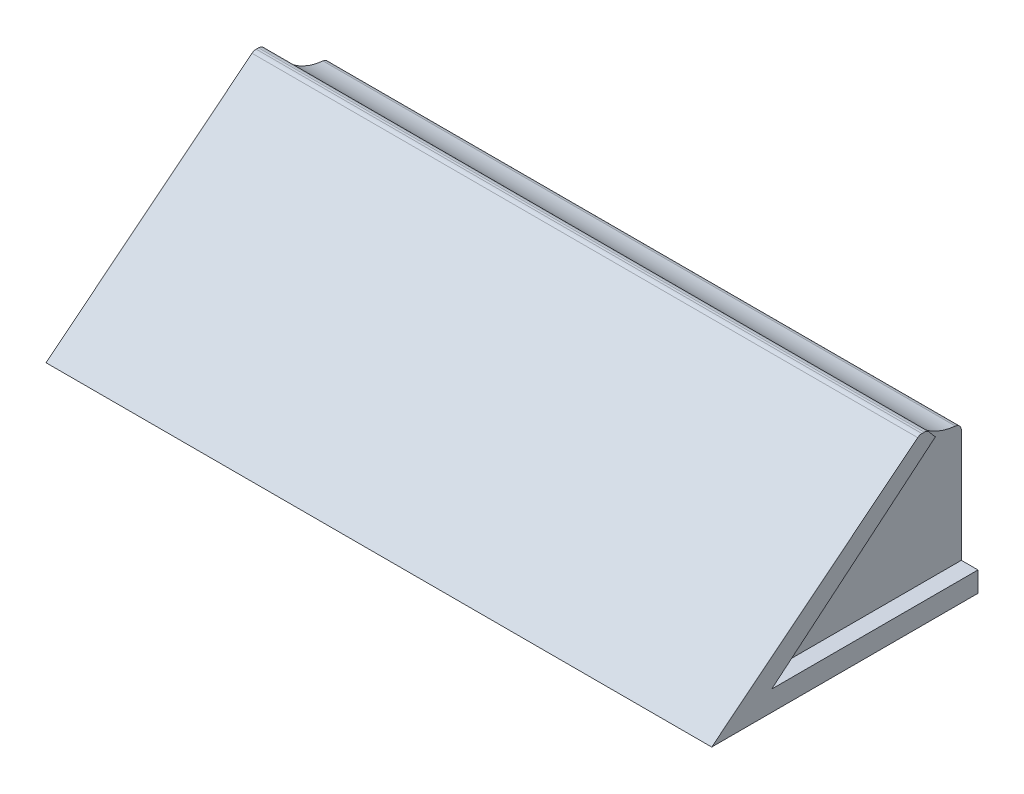
ISO-10303-21;
HEADER;
FILE_DESCRIPTION(('STEP AP214'),'2;1');
FILE_NAME('part.step','',(''),(''),'','','');
FILE_SCHEMA(('AUTOMOTIVE_DESIGN { 1 0 10303 214 1 1 1 1 }'));
ENDSEC;
DATA;
#1=APPLICATION_CONTEXT('core data for automotive mechanical design processes');
#2=APPLICATION_PROTOCOL_DEFINITION('international standard','automotive_design',2000,#1);
#3=PRODUCT_CONTEXT('',#1,'mechanical');
#4=PRODUCT('Part','Part','',(#3));
#5=PRODUCT_RELATED_PRODUCT_CATEGORY('part','',(#4));
#6=PRODUCT_DEFINITION_FORMATION('','',#4);
#7=PRODUCT_DEFINITION_CONTEXT('part definition',#1,'design');
#8=PRODUCT_DEFINITION('design','',#6,#7);
#9=PRODUCT_DEFINITION_SHAPE('','',#8);
#10=(LENGTH_UNIT() NAMED_UNIT(*) SI_UNIT(.MILLI.,.METRE.));
#11=(NAMED_UNIT(*) PLANE_ANGLE_UNIT() SI_UNIT($,.RADIAN.));
#12=(NAMED_UNIT(*) SI_UNIT($,.STERADIAN.) SOLID_ANGLE_UNIT());
#13=UNCERTAINTY_MEASURE_WITH_UNIT(LENGTH_MEASURE(1.E-05),#10,'distance_accuracy_value','');
#14=(GEOMETRIC_REPRESENTATION_CONTEXT(3) GLOBAL_UNCERTAINTY_ASSIGNED_CONTEXT((#13)) GLOBAL_UNIT_ASSIGNED_CONTEXT((#10,
#11,#12)) REPRESENTATION_CONTEXT('',''));
#15=CARTESIAN_POINT('',(0.,0.,0.));
#16=DIRECTION('',(0.,0.,1.));
#17=DIRECTION('',(1.,0.,0.));
#18=AXIS2_PLACEMENT_3D('',#15,#16,#17);
#19=CARTESIAN_POINT('',(0.,0.,0.));
#20=DIRECTION('',(0.,0.,1.));
#21=DIRECTION('',(1.,0.,0.));
#22=AXIS2_PLACEMENT_3D('',#19,#20,#21);
#23=PLANE('',#22);
#24=DIRECTION('',(0.,-1.,0.));
#25=VECTOR('',#24,1.);
#26=CARTESIAN_POINT('',(-100.,0.,0.));
#27=LINE('',#26,#25);
#28=CARTESIAN_POINT('',(-100.,3.04421217508157,0.));
#29=VERTEX_POINT('',#28);
#30=CARTESIAN_POINT('',(-100.,0.,0.));
#31=VERTEX_POINT('',#30);
#32=EDGE_CURVE('E217',#29,#31,#27,.T.);
#33=ORIENTED_EDGE('',*,*,#32,.F.);
#34=DIRECTION('',(1.,0.,0.));
#35=VECTOR('',#34,1.);
#36=CARTESIAN_POINT('',(-363.20840242185,3.04421217508157,0.));
#37=LINE('',#36,#35);
#38=CARTESIAN_POINT('',(-97.5,3.04421217508157,0.));
#39=VERTEX_POINT('',#38);
#40=EDGE_CURVE('E58',#29,#39,#37,.T.);
#41=ORIENTED_EDGE('',*,*,#40,.T.);
#42=DIRECTION('',(0.,-1.,0.));
#43=VECTOR('',#42,1.);
#44=CARTESIAN_POINT('',(-97.5,0.,0.));
#45=LINE('',#44,#43);
#46=CARTESIAN_POINT('',(-97.5,19.9603871003877,0.));
#47=VERTEX_POINT('',#46);
#48=EDGE_CURVE('E153',#47,#39,#45,.T.);
#49=ORIENTED_EDGE('',*,*,#48,.F.);
#50=DIRECTION('',(1.,0.,0.));
#51=VECTOR('',#50,1.);
#52=CARTESIAN_POINT('',(0.,19.9603871003877,0.));
#53=LINE('',#52,#51);
#54=CARTESIAN_POINT('',(-2.5,19.9603871003877,0.));
#55=VERTEX_POINT('',#54);
#56=EDGE_CURVE('E11',#47,#55,#53,.T.);
#57=ORIENTED_EDGE('',*,*,#56,.T.);
#58=DIRECTION('',(0.,1.,0.));
#59=VECTOR('',#58,1.);
#60=CARTESIAN_POINT('',(-2.5,0.,0.));
#61=LINE('',#60,#59);
#62=CARTESIAN_POINT('',(-2.5,3.04421217508157,0.));
#63=VERTEX_POINT('',#62);
#64=EDGE_CURVE('E165',#63,#55,#61,.T.);
#65=ORIENTED_EDGE('',*,*,#64,.F.);
#66=DIRECTION('',(-1.,0.,0.));
#67=VECTOR('',#66,1.);
#68=CARTESIAN_POINT('',(263.20840242185,3.04421217508157,0.));
#69=LINE('',#68,#67);
#70=CARTESIAN_POINT('',(0.,3.04421217508157,0.));
#71=VERTEX_POINT('',#70);
#72=EDGE_CURVE('E181',#71,#63,#69,.T.);
#73=ORIENTED_EDGE('',*,*,#72,.F.);
#74=DIRECTION('',(0.,1.,0.));
#75=VECTOR('',#74,1.);
#76=CARTESIAN_POINT('',(0.,0.,0.));
#77=LINE('',#76,#75);
#78=CARTESIAN_POINT('',(0.,0.,0.));
#79=VERTEX_POINT('',#78);
#80=EDGE_CURVE('E209',#79,#71,#77,.T.);
#81=ORIENTED_EDGE('',*,*,#80,.F.);
#82=DIRECTION('',(1.,0.,0.));
#83=VECTOR('',#82,1.);
#84=CARTESIAN_POINT('',(0.,0.,0.));
#85=LINE('',#84,#83);
#86=EDGE_CURVE('E214',#31,#79,#85,.T.);
#87=ORIENTED_EDGE('',*,*,#86,.F.);
#88=EDGE_LOOP('',(#33,#41,#49,#57,#65,#73,#81,#87));
#89=FACE_BOUND('',#88,.T.);
#90=ADVANCED_FACE('F43',(#89),#23,.F.);
#91=CARTESIAN_POINT('',(0.,0.,40.));
#92=DIRECTION('',(-1.,0.,0.));
#93=DIRECTION('',(0.,0.,1.));
#94=AXIS2_PLACEMENT_3D('',#91,#92,#93);
#95=PLANE('',#94);
#96=DIRECTION('',(0.,-0.640662847266887,0.767822320678349));
#97=VECTOR('',#96,1.);
#98=CARTESIAN_POINT('',(0.,3.04421217508157,30.9904602946265));
#99=LINE('',#98,#97);
#100=CARTESIAN_POINT('',(0.,23.5686529399338,6.39230573341903));
#101=VERTEX_POINT('',#100);
#102=CARTESIAN_POINT('',(0.,3.04421217508157,30.9904602946265));
#103=VERTEX_POINT('',#102);
#104=EDGE_CURVE('E186',#101,#103,#99,.T.);
#105=ORIENTED_EDGE('',*,*,#104,.F.);
#106=CARTESIAN_POINT('',(0.,29.9214478082457,0.00173935535852793));
#107=DIRECTION('',(-1.,0.,0.));
#108=DIRECTION('',(0.,0.,1.));
#109=AXIS2_PLACEMENT_3D('',#106,#107,#108);
#110=CIRCLE('',#109,9.01095673451205);
#111=CARTESIAN_POINT('',(0.,24.5914966936009,7.26734066473031));
#112=VERTEX_POINT('',#111);
#113=EDGE_CURVE('E198',#112,#101,#110,.F.);
#114=ORIENTED_EDGE('',*,*,#113,.F.);
#115=CARTESIAN_POINT('',(0.,24.,8.07364808839648));
#116=DIRECTION('',(-1.,0.,0.));
#117=DIRECTION('',(0.,0.,1.));
#118=AXIS2_PLACEMENT_3D('',#115,#116,#117);
#119=CIRCLE('',#118,1.);
#120=CARTESIAN_POINT('',(0.,25.,8.07364808839648));
#121=VERTEX_POINT('',#120);
#122=EDGE_CURVE('E252',#112,#121,#119,.F.);
#123=ORIENTED_EDGE('',*,*,#122,.T.);
#124=DIRECTION('',(0.,0.,-1.));
#125=VECTOR('',#124,1.);
#126=CARTESIAN_POINT('',(0.,25.,40.));
#127=LINE('',#126,#125);
#128=CARTESIAN_POINT('',(0.,25.,8.42577126850469));
#129=VERTEX_POINT('',#128);
#130=EDGE_CURVE('E228',#129,#121,#127,.T.);
#131=ORIENTED_EDGE('',*,*,#130,.F.);
#132=CARTESIAN_POINT('',(0.,24.,8.42577126850469));
#133=DIRECTION('',(-1.,0.,0.));
#134=DIRECTION('',(0.,0.,1.));
#135=AXIS2_PLACEMENT_3D('',#132,#133,#134);
#136=CIRCLE('',#135,1.);
#137=CARTESIAN_POINT('',(0.,24.7806073928726,9.05079294668288));
#138=VERTEX_POINT('',#137);
#139=EDGE_CURVE('E242',#129,#138,#136,.F.);
#140=ORIENTED_EDGE('',*,*,#139,.T.);
#141=DIRECTION('',(0.,0.625021678178202,-0.780607392872566));
#142=VECTOR('',#141,1.);
#143=CARTESIAN_POINT('',(0.,0.,40.));
#144=LINE('',#143,#142);
#145=CARTESIAN_POINT('',(0.,0.,40.));
#146=VERTEX_POINT('',#145);
#147=EDGE_CURVE('E206',#146,#138,#144,.T.);
#148=ORIENTED_EDGE('',*,*,#147,.F.);
#149=DIRECTION('',(0.,0.,-1.));
#150=VECTOR('',#149,1.);
#151=CARTESIAN_POINT('',(0.,0.,40.));
#152=LINE('',#151,#150);
#153=EDGE_CURVE('E213',#146,#79,#152,.T.);
#154=ORIENTED_EDGE('',*,*,#153,.T.);
#155=ORIENTED_EDGE('',*,*,#80,.T.);
#156=DIRECTION('',(0.,0.,-1.));
#157=VECTOR('',#156,1.);
#158=CARTESIAN_POINT('',(0.,3.04421217508157,0.));
#159=LINE('',#158,#157);
#160=EDGE_CURVE('E185',#103,#71,#159,.T.);
#161=ORIENTED_EDGE('',*,*,#160,.F.);
#162=EDGE_LOOP('',(#105,#114,#123,#131,#140,#148,#154,#155,#161));
#163=FACE_BOUND('',#162,.T.);
#164=ADVANCED_FACE('F261',(#163),#95,.F.);
#165=CARTESIAN_POINT('',(138.20840242185,29.9214478082457,0.00173935535852793));
#166=DIRECTION('',(-1.,0.,0.));
#167=DIRECTION('',(0.,0.,1.));
#168=AXIS2_PLACEMENT_3D('',#165,#166,#167);
#169=CYLINDRICAL_SURFACE('',#168,9.01095673451205);
#170=DIRECTION('',(1.,0.,0.));
#171=VECTOR('',#170,1.);
#172=CARTESIAN_POINT('',(-363.20840242185,23.5557804419818,6.37948349049999));
#173=LINE('',#172,#171);
#174=CARTESIAN_POINT('',(-100.,23.5557804419819,6.37948349049998));
#175=VERTEX_POINT('',#174);
#176=CARTESIAN_POINT('',(-97.5,23.5557804419819,6.37948349049998));
#177=VERTEX_POINT('',#176);
#178=EDGE_CURVE('E162',#175,#177,#173,.T.);
#179=ORIENTED_EDGE('',*,*,#178,.F.);
#180=CARTESIAN_POINT('',(-100.,29.9214478082457,0.00173935535852793));
#181=DIRECTION('',(1.,0.,0.));
#182=DIRECTION('',(0.,0.,-1.));
#183=AXIS2_PLACEMENT_3D('',#180,#181,#182);
#184=CIRCLE('',#183,9.01095673451205);
#185=CARTESIAN_POINT('',(-100.,24.5914966936009,7.26734066473031));
#186=VERTEX_POINT('',#185);
#187=EDGE_CURVE('E233',#175,#186,#184,.F.);
#188=ORIENTED_EDGE('',*,*,#187,.T.);
#189=DIRECTION('',(-1.,0.,0.));
#190=VECTOR('',#189,1.);
#191=CARTESIAN_POINT('',(138.20840242185,24.5914966936009,7.26734066473031));
#192=LINE('',#191,#190);
#193=EDGE_CURVE('E250',#186,#112,#192,.F.);
#194=ORIENTED_EDGE('',*,*,#193,.T.);
#195=ORIENTED_EDGE('',*,*,#113,.T.);
#196=DIRECTION('',(-1.,0.,0.));
#197=VECTOR('',#196,1.);
#198=CARTESIAN_POINT('',(263.20840242185,23.5686529399338,6.39230573341903));
#199=LINE('',#198,#197);
#200=CARTESIAN_POINT('',(-2.5,23.5686529399338,6.39230573341903));
#201=VERTEX_POINT('',#200);
#202=EDGE_CURVE('E194',#101,#201,#199,.T.);
#203=ORIENTED_EDGE('',*,*,#202,.T.);
#204=CARTESIAN_POINT('',(-2.5,29.9214478082457,0.00173935535852793));
#205=DIRECTION('',(-1.,0.,0.));
#206=DIRECTION('',(0.,0.,1.));
#207=AXIS2_PLACEMENT_3D('',#204,#205,#206);
#208=CIRCLE('',#207,9.01095673451205);
#209=CARTESIAN_POINT('',(-2.5,20.955402958714,0.900283192594366));
#210=VERTEX_POINT('',#209);
#211=EDGE_CURVE('E189',#201,#210,#208,.F.);
#212=ORIENTED_EDGE('',*,*,#211,.T.);
#213=DIRECTION('',(-1.,0.,0.));
#214=VECTOR('',#213,1.);
#215=CARTESIAN_POINT('',(138.20840242185,20.955402958714,0.900283192594366));
#216=LINE('',#215,#214);
#217=CARTESIAN_POINT('',(-97.5,20.955402958714,0.900283192594366));
#218=VERTEX_POINT('',#217);
#219=EDGE_CURVE('E51',#210,#218,#216,.T.);
#220=ORIENTED_EDGE('',*,*,#219,.T.);
#221=CARTESIAN_POINT('',(-97.5,29.9214478082457,0.00173935535852793));
#222=DIRECTION('',(1.,0.,0.));
#223=DIRECTION('',(0.,0.,-1.));
#224=AXIS2_PLACEMENT_3D('',#221,#222,#223);
#225=CIRCLE('',#224,9.01095673451205);
#226=EDGE_CURVE('E173',#218,#177,#225,.F.);
#227=ORIENTED_EDGE('',*,*,#226,.T.);
#228=EDGE_LOOP('',(#179,#188,#194,#195,#203,#212,#220,#227));
#229=FACE_BOUND('',#228,.T.);
#230=ADVANCED_FACE('F255',(#229),#169,.F.);
#231=CARTESIAN_POINT('',(0.,25.,40.));
#232=DIRECTION('',(0.,-1.,0.));
#233=DIRECTION('',(1.,0.,0.));
#234=AXIS2_PLACEMENT_3D('',#231,#232,#233);
#235=PLANE('',#234);
#236=ORIENTED_EDGE('',*,*,#130,.T.);
#237=DIRECTION('',(1.,0.,0.));
#238=VECTOR('',#237,1.);
#239=CARTESIAN_POINT('',(-100.,25.,8.07364808839648));
#240=LINE('',#239,#238);
#241=CARTESIAN_POINT('',(-100.,25.,8.07364808839648));
#242=VERTEX_POINT('',#241);
#243=EDGE_CURVE('E244',#121,#242,#240,.F.);
#244=ORIENTED_EDGE('',*,*,#243,.T.);
#245=DIRECTION('',(0.,0.,-1.));
#246=VECTOR('',#245,1.);
#247=CARTESIAN_POINT('',(-100.,25.,40.));
#248=LINE('',#247,#246);
#249=CARTESIAN_POINT('',(-100.,25.,8.42577126850471));
#250=VERTEX_POINT('',#249);
#251=EDGE_CURVE('E225',#250,#242,#248,.T.);
#252=ORIENTED_EDGE('',*,*,#251,.F.);
#253=DIRECTION('',(-1.,0.,0.));
#254=VECTOR('',#253,1.);
#255=CARTESIAN_POINT('',(0.,25.,8.42577126850469));
#256=LINE('',#255,#254);
#257=EDGE_CURVE('E240',#250,#129,#256,.F.);
#258=ORIENTED_EDGE('',*,*,#257,.T.);
#259=EDGE_LOOP('',(#236,#244,#252,#258));
#260=FACE_BOUND('',#259,.T.);
#261=ADVANCED_FACE('F281',(#260),#235,.F.);
#262=CARTESIAN_POINT('',(-100.,0.,40.));
#263=DIRECTION('',(1.,0.,0.));
#264=DIRECTION('',(0.,0.,-1.));
#265=AXIS2_PLACEMENT_3D('',#262,#263,#264);
#266=PLANE('',#265);
#267=ORIENTED_EDGE('',*,*,#187,.F.);
#268=DIRECTION('',(0.,-0.642774471446734,0.766055467219164));
#269=VECTOR('',#268,1.);
#270=CARTESIAN_POINT('',(-100.,3.04421217508157,30.8250700999554));
#271=LINE('',#270,#269);
#272=CARTESIAN_POINT('',(-100.,3.04421217508157,30.8250700999554));
#273=VERTEX_POINT('',#272);
#274=EDGE_CURVE('E66',#175,#273,#271,.T.);
#275=ORIENTED_EDGE('',*,*,#274,.T.);
#276=DIRECTION('',(0.,0.,-1.));
#277=VECTOR('',#276,1.);
#278=CARTESIAN_POINT('',(-100.,3.04421217508157,0.));
#279=LINE('',#278,#277);
#280=EDGE_CURVE('E156',#273,#29,#279,.T.);
#281=ORIENTED_EDGE('',*,*,#280,.T.);
#282=ORIENTED_EDGE('',*,*,#32,.T.);
#283=DIRECTION('',(0.,0.,-1.));
#284=VECTOR('',#283,1.);
#285=CARTESIAN_POINT('',(-100.,0.,40.));
#286=LINE('',#285,#284);
#287=CARTESIAN_POINT('',(-100.,0.,40.));
#288=VERTEX_POINT('',#287);
#289=EDGE_CURVE('E222',#288,#31,#286,.T.);
#290=ORIENTED_EDGE('',*,*,#289,.F.);
#291=DIRECTION('',(0.,-0.625021678178202,0.780607392872566));
#292=VECTOR('',#291,1.);
#293=CARTESIAN_POINT('',(-100.,0.,40.));
#294=LINE('',#293,#292);
#295=CARTESIAN_POINT('',(-100.,24.7806073928726,9.0507929466829));
#296=VERTEX_POINT('',#295);
#297=EDGE_CURVE('E231',#296,#288,#294,.T.);
#298=ORIENTED_EDGE('',*,*,#297,.F.);
#299=CARTESIAN_POINT('',(-100.,24.,8.42577126850471));
#300=DIRECTION('',(1.,0.,0.));
#301=DIRECTION('',(0.,0.,-1.));
#302=AXIS2_PLACEMENT_3D('',#299,#300,#301);
#303=CIRCLE('',#302,1.);
#304=EDGE_CURVE('E238',#296,#250,#303,.F.);
#305=ORIENTED_EDGE('',*,*,#304,.T.);
#306=ORIENTED_EDGE('',*,*,#251,.T.);
#307=CARTESIAN_POINT('',(-100.,24.,8.07364808839648));
#308=DIRECTION('',(1.,0.,0.));
#309=DIRECTION('',(0.,0.,-1.));
#310=AXIS2_PLACEMENT_3D('',#307,#308,#309);
#311=CIRCLE('',#310,1.);
#312=EDGE_CURVE('E247',#242,#186,#311,.F.);
#313=ORIENTED_EDGE('',*,*,#312,.T.);
#314=EDGE_LOOP('',(#267,#275,#281,#282,#290,#298,#305,#306,#313));
#315=FACE_BOUND('',#314,.T.);
#316=ADVANCED_FACE('F277',(#315),#266,.F.);
#317=CARTESIAN_POINT('',(0.,0.,40.));
#318=DIRECTION('',(0.,1.,0.));
#319=DIRECTION('',(-1.,0.,0.));
#320=AXIS2_PLACEMENT_3D('',#317,#318,#319);
#321=PLANE('',#320);
#322=ORIENTED_EDGE('',*,*,#86,.T.);
#323=ORIENTED_EDGE('',*,*,#153,.F.);
#324=DIRECTION('',(1.,0.,0.));
#325=VECTOR('',#324,1.);
#326=CARTESIAN_POINT('',(0.,0.,40.));
#327=LINE('',#326,#325);
#328=EDGE_CURVE('E210',#288,#146,#327,.T.);
#329=ORIENTED_EDGE('',*,*,#328,.F.);
#330=ORIENTED_EDGE('',*,*,#289,.T.);
#331=EDGE_LOOP('',(#322,#323,#329,#330));
#332=FACE_BOUND('',#331,.T.);
#333=ADVANCED_FACE('F274',(#332),#321,.F.);
#334=CARTESIAN_POINT('',(138.20840242185,0.,40.));
#335=DIRECTION('',(0.,0.780607392872566,0.625021678178202));
#336=DIRECTION('',(0.,-0.625021678178202,0.780607392872566));
#337=AXIS2_PLACEMENT_3D('',#334,#335,#336);
#338=PLANE('',#337);
#339=ORIENTED_EDGE('',*,*,#147,.T.);
#340=DIRECTION('',(-1.,0.,0.));
#341=VECTOR('',#340,1.);
#342=CARTESIAN_POINT('',(-100.,24.7806073928726,9.05079294668291));
#343=LINE('',#342,#341);
#344=EDGE_CURVE('E235',#138,#296,#343,.T.);
#345=ORIENTED_EDGE('',*,*,#344,.T.);
#346=ORIENTED_EDGE('',*,*,#297,.T.);
#347=ORIENTED_EDGE('',*,*,#328,.T.);
#348=EDGE_LOOP('',(#339,#345,#346,#347));
#349=FACE_BOUND('',#348,.T.);
#350=ADVANCED_FACE('F272',(#349),#338,.T.);
#351=CARTESIAN_POINT('',(138.20840242185,24.,8.42577126850466));
#352=DIRECTION('',(1.,0.,0.));
#353=DIRECTION('',(0.,0.,-1.));
#354=AXIS2_PLACEMENT_3D('',#351,#352,#353);
#355=CYLINDRICAL_SURFACE('',#354,1.);
#356=ORIENTED_EDGE('',*,*,#139,.F.);
#357=ORIENTED_EDGE('',*,*,#257,.F.);
#358=ORIENTED_EDGE('',*,*,#304,.F.);
#359=ORIENTED_EDGE('',*,*,#344,.F.);
#360=EDGE_LOOP('',(#356,#357,#358,#359));
#361=FACE_BOUND('',#360,.T.);
#362=ADVANCED_FACE('F285',(#361),#355,.T.);
#363=CARTESIAN_POINT('',(138.20840242185,24.,8.07364808839648));
#364=DIRECTION('',(-1.,0.,0.));
#365=DIRECTION('',(0.,0.,1.));
#366=AXIS2_PLACEMENT_3D('',#363,#364,#365);
#367=CYLINDRICAL_SURFACE('',#366,1.);
#368=ORIENTED_EDGE('',*,*,#122,.F.);
#369=ORIENTED_EDGE('',*,*,#193,.F.);
#370=ORIENTED_EDGE('',*,*,#312,.F.);
#371=ORIENTED_EDGE('',*,*,#243,.F.);
#372=EDGE_LOOP('',(#368,#369,#370,#371));
#373=FACE_BOUND('',#372,.T.);
#374=ADVANCED_FACE('F287',(#373),#367,.T.);
#375=CARTESIAN_POINT('',(138.20840242185,19.9603871003877,1.));
#376=DIRECTION('',(-1.,0.,0.));
#377=DIRECTION('',(0.,0.,1.));
#378=AXIS2_PLACEMENT_3D('',#375,#376,#377);
#379=CYLINDRICAL_SURFACE('',#378,1.);
#380=CARTESIAN_POINT('',(-97.5,19.9603871003877,1.));
#381=DIRECTION('',(1.,0.,0.));
#382=DIRECTION('',(0.,0.,-1.));
#383=AXIS2_PLACEMENT_3D('',#380,#381,#382);
#384=CIRCLE('',#383,1.);
#385=EDGE_CURVE('E175',#218,#47,#384,.F.);
#386=ORIENTED_EDGE('',*,*,#385,.F.);
#387=ORIENTED_EDGE('',*,*,#219,.F.);
#388=CARTESIAN_POINT('',(-2.5,19.9603871003877,1.));
#389=DIRECTION('',(-1.,0.,0.));
#390=DIRECTION('',(0.,0.,1.));
#391=AXIS2_PLACEMENT_3D('',#388,#389,#390);
#392=CIRCLE('',#391,1.);
#393=EDGE_CURVE('E168',#55,#210,#392,.F.);
#394=ORIENTED_EDGE('',*,*,#393,.F.);
#395=ORIENTED_EDGE('',*,*,#56,.F.);
#396=EDGE_LOOP('',(#386,#387,#394,#395));
#397=FACE_BOUND('',#396,.T.);
#398=ADVANCED_FACE('F45',(#397),#379,.T.);
#399=CARTESIAN_POINT('',(263.20840242185,3.04421217508157,30.9904602946265));
#400=DIRECTION('',(0.,0.767822320678349,0.640662847266887));
#401=DIRECTION('',(0.,-0.640662847266887,0.767822320678349));
#402=AXIS2_PLACEMENT_3D('',#399,#400,#401);
#403=PLANE('',#402);
#404=ORIENTED_EDGE('',*,*,#104,.T.);
#405=DIRECTION('',(-1.,0.,0.));
#406=VECTOR('',#405,1.);
#407=CARTESIAN_POINT('',(263.20840242185,3.04421217508157,30.9904602946265));
#408=LINE('',#407,#406);
#409=CARTESIAN_POINT('',(-2.5,3.04421217508157,30.9904602946265));
#410=VERTEX_POINT('',#409);
#411=EDGE_CURVE('E196',#103,#410,#408,.T.);
#412=ORIENTED_EDGE('',*,*,#411,.T.);
#413=DIRECTION('',(0.,-0.640662847266887,0.767822320678349));
#414=VECTOR('',#413,1.);
#415=CARTESIAN_POINT('',(-2.5,3.04421217508157,30.9904602946265));
#416=LINE('',#415,#414);
#417=EDGE_CURVE('E178',#201,#410,#416,.T.);
#418=ORIENTED_EDGE('',*,*,#417,.F.);
#419=ORIENTED_EDGE('',*,*,#202,.F.);
#420=EDGE_LOOP('',(#404,#412,#418,#419));
#421=FACE_BOUND('',#420,.T.);
#422=ADVANCED_FACE('F294',(#421),#403,.F.);
#423=CARTESIAN_POINT('',(263.20840242185,3.04421217508157,0.));
#424=DIRECTION('',(0.,-1.,0.));
#425=DIRECTION('',(0.,0.,-1.));
#426=AXIS2_PLACEMENT_3D('',#423,#424,#425);
#427=PLANE('',#426);
#428=ORIENTED_EDGE('',*,*,#160,.T.);
#429=ORIENTED_EDGE('',*,*,#72,.T.);
#430=DIRECTION('',(0.,0.,-1.));
#431=VECTOR('',#430,1.);
#432=CARTESIAN_POINT('',(-2.5,3.04421217508157,0.));
#433=LINE('',#432,#431);
#434=EDGE_CURVE('E182',#410,#63,#433,.T.);
#435=ORIENTED_EDGE('',*,*,#434,.F.);
#436=ORIENTED_EDGE('',*,*,#411,.F.);
#437=EDGE_LOOP('',(#428,#429,#435,#436));
#438=FACE_BOUND('',#437,.T.);
#439=ADVANCED_FACE('F319',(#438),#427,.F.);
#440=CARTESIAN_POINT('',(-2.5,0.,40.));
#441=DIRECTION('',(-1.,0.,0.));
#442=DIRECTION('',(0.,0.,1.));
#443=AXIS2_PLACEMENT_3D('',#440,#441,#442);
#444=PLANE('',#443);
#445=ORIENTED_EDGE('',*,*,#434,.T.);
#446=ORIENTED_EDGE('',*,*,#64,.T.);
#447=ORIENTED_EDGE('',*,*,#393,.T.);
#448=ORIENTED_EDGE('',*,*,#211,.F.);
#449=ORIENTED_EDGE('',*,*,#417,.T.);
#450=EDGE_LOOP('',(#445,#446,#447,#448,#449));
#451=FACE_BOUND('',#450,.T.);
#452=ADVANCED_FACE('F316',(#451),#444,.F.);
#453=CARTESIAN_POINT('',(-363.20840242185,3.04421217508157,30.8250700999554));
#454=DIRECTION('',(0.,-0.766055467219164,-0.642774471446734));
#455=DIRECTION('',(0.,0.642774471446734,-0.766055467219164));
#456=AXIS2_PLACEMENT_3D('',#453,#454,#455);
#457=PLANE('',#456);
#458=ORIENTED_EDGE('',*,*,#274,.F.);
#459=ORIENTED_EDGE('',*,*,#178,.T.);
#460=DIRECTION('',(0.,-0.642774471446734,0.766055467219164));
#461=VECTOR('',#460,1.);
#462=CARTESIAN_POINT('',(-97.5,3.04421217508157,30.8250700999554));
#463=LINE('',#462,#461);
#464=CARTESIAN_POINT('',(-97.5,3.04421217508157,30.8250700999554));
#465=VERTEX_POINT('',#464);
#466=EDGE_CURVE('E150',#177,#465,#463,.T.);
#467=ORIENTED_EDGE('',*,*,#466,.T.);
#468=DIRECTION('',(1.,0.,0.));
#469=VECTOR('',#468,1.);
#470=CARTESIAN_POINT('',(-363.20840242185,3.04421217508157,30.8250700999554));
#471=LINE('',#470,#469);
#472=EDGE_CURVE('E161',#273,#465,#471,.T.);
#473=ORIENTED_EDGE('',*,*,#472,.F.);
#474=EDGE_LOOP('',(#458,#459,#467,#473));
#475=FACE_BOUND('',#474,.T.);
#476=ADVANCED_FACE('F160',(#475),#457,.T.);
#477=CARTESIAN_POINT('',(-363.20840242185,3.04421217508157,0.));
#478=DIRECTION('',(0.,1.,0.));
#479=DIRECTION('',(0.,0.,1.));
#480=AXIS2_PLACEMENT_3D('',#477,#478,#479);
#481=PLANE('',#480);
#482=ORIENTED_EDGE('',*,*,#280,.F.);
#483=ORIENTED_EDGE('',*,*,#472,.T.);
#484=DIRECTION('',(0.,0.,-1.));
#485=VECTOR('',#484,1.);
#486=CARTESIAN_POINT('',(-97.5,3.04421217508157,0.));
#487=LINE('',#486,#485);
#488=EDGE_CURVE('E146',#465,#39,#487,.T.);
#489=ORIENTED_EDGE('',*,*,#488,.T.);
#490=ORIENTED_EDGE('',*,*,#40,.F.);
#491=EDGE_LOOP('',(#482,#483,#489,#490));
#492=FACE_BOUND('',#491,.T.);
#493=ADVANCED_FACE('F164',(#492),#481,.T.);
#494=CARTESIAN_POINT('',(-97.5,0.,40.));
#495=DIRECTION('',(1.,0.,0.));
#496=DIRECTION('',(0.,0.,-1.));
#497=AXIS2_PLACEMENT_3D('',#494,#495,#496);
#498=PLANE('',#497);
#499=ORIENTED_EDGE('',*,*,#48,.T.);
#500=ORIENTED_EDGE('',*,*,#488,.F.);
#501=ORIENTED_EDGE('',*,*,#466,.F.);
#502=ORIENTED_EDGE('',*,*,#226,.F.);
#503=ORIENTED_EDGE('',*,*,#385,.T.);
#504=EDGE_LOOP('',(#499,#500,#501,#502,#503));
#505=FACE_BOUND('',#504,.T.);
#506=ADVANCED_FACE('F148',(#505),#498,.F.);
#507=CLOSED_SHELL('',(#90,#164,#230,#261,#316,#333,#350,#362,#374,#398,#422,#439,#452,#476,#493,#506));
#508=MANIFOLD_SOLID_BREP('B2',#507);
#509=ADVANCED_BREP_SHAPE_REPRESENTATION('',(#18,#508),#14);
#510=SHAPE_DEFINITION_REPRESENTATION(#9,#509);
ENDSEC;
END-ISO-10303-21;
